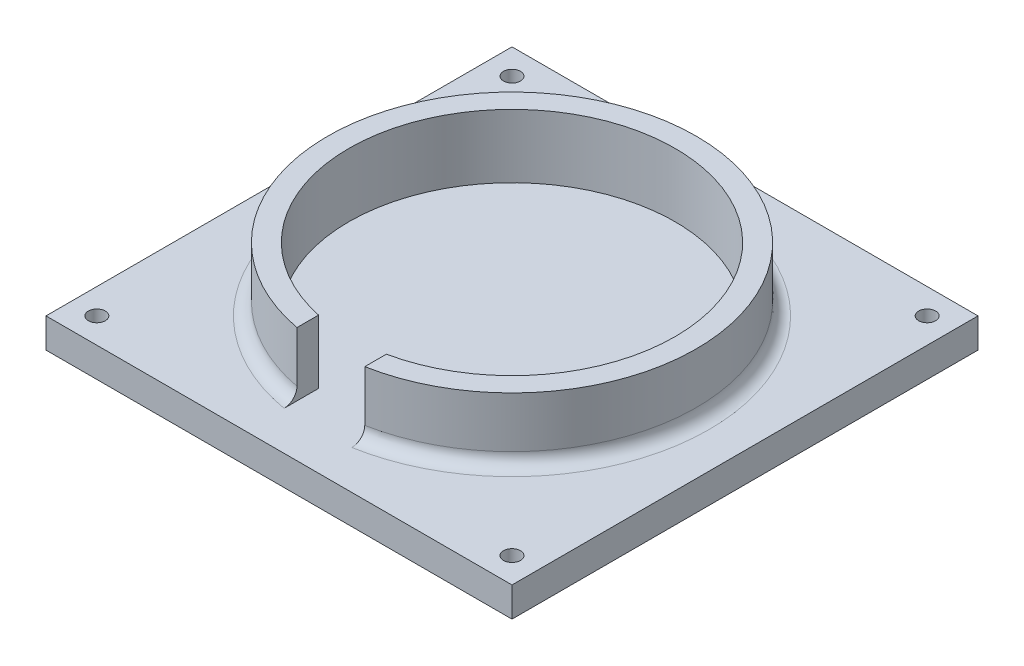
ISO-10303-21;
HEADER;
FILE_DESCRIPTION(('STEP AP214'),'2;1');
FILE_NAME('part.step','',(''),(''),'','','');
FILE_SCHEMA(('AUTOMOTIVE_DESIGN { 1 0 10303 214 1 1 1 1 }'));
ENDSEC;
DATA;
#1=APPLICATION_CONTEXT('core data for automotive mechanical design processes');
#2=APPLICATION_PROTOCOL_DEFINITION('international standard','automotive_design',2000,#1);
#3=PRODUCT_CONTEXT('',#1,'mechanical');
#4=PRODUCT('Part','Part','',(#3));
#5=PRODUCT_RELATED_PRODUCT_CATEGORY('part','',(#4));
#6=PRODUCT_DEFINITION_FORMATION('','',#4);
#7=PRODUCT_DEFINITION_CONTEXT('part definition',#1,'design');
#8=PRODUCT_DEFINITION('design','',#6,#7);
#9=PRODUCT_DEFINITION_SHAPE('','',#8);
#10=(LENGTH_UNIT() NAMED_UNIT(*) SI_UNIT(.MILLI.,.METRE.));
#11=(NAMED_UNIT(*) PLANE_ANGLE_UNIT() SI_UNIT($,.RADIAN.));
#12=(NAMED_UNIT(*) SI_UNIT($,.STERADIAN.) SOLID_ANGLE_UNIT());
#13=UNCERTAINTY_MEASURE_WITH_UNIT(LENGTH_MEASURE(1.E-05),#10,'distance_accuracy_value','');
#14=(GEOMETRIC_REPRESENTATION_CONTEXT(3) GLOBAL_UNCERTAINTY_ASSIGNED_CONTEXT((#13)) GLOBAL_UNIT_ASSIGNED_CONTEXT((#10,
#11,#12)) REPRESENTATION_CONTEXT('',''));
#15=CARTESIAN_POINT('',(0.,0.,0.));
#16=DIRECTION('',(0.,0.,1.));
#17=DIRECTION('',(1.,0.,0.));
#18=AXIS2_PLACEMENT_3D('',#15,#16,#17);
#19=CARTESIAN_POINT('',(83.4783234697371,7.,-31.7251665519029));
#20=DIRECTION('',(0.,0.,1.));
#21=DIRECTION('',(1.,0.,0.));
#22=AXIS2_PLACEMENT_3D('',#19,#20,#21);
#23=PLANE('',#22);
#24=DIRECTION('',(-1.,0.,0.));
#25=VECTOR('',#24,1.);
#26=CARTESIAN_POINT('',(83.4783234697371,0.,-31.7251665519029));
#27=LINE('',#26,#25);
#28=CARTESIAN_POINT('',(83.4783234697371,0.,-31.7251665519029));
#29=VERTEX_POINT('',#28);
#30=CARTESIAN_POINT('',(-26.5216765302629,0.,-31.7251665519029));
#31=VERTEX_POINT('',#30);
#32=EDGE_CURVE('E144',#29,#31,#27,.T.);
#33=ORIENTED_EDGE('',*,*,#32,.T.);
#34=DIRECTION('',(0.,-1.,0.));
#35=VECTOR('',#34,1.);
#36=CARTESIAN_POINT('',(-26.5216765302629,7.,-31.7251665519029));
#37=LINE('',#36,#35);
#38=CARTESIAN_POINT('',(-26.5216765302629,7.,-31.7251665519029));
#39=VERTEX_POINT('',#38);
#40=EDGE_CURVE('E186',#39,#31,#37,.T.);
#41=ORIENTED_EDGE('',*,*,#40,.F.);
#42=DIRECTION('',(-1.,0.,0.));
#43=VECTOR('',#42,1.);
#44=CARTESIAN_POINT('',(83.4783234697371,7.,-31.7251665519029));
#45=LINE('',#44,#43);
#46=CARTESIAN_POINT('',(83.4783234697371,7.,-31.7251665519029));
#47=VERTEX_POINT('',#46);
#48=EDGE_CURVE('E149',#47,#39,#45,.T.);
#49=ORIENTED_EDGE('',*,*,#48,.F.);
#50=DIRECTION('',(0.,-1.,0.));
#51=VECTOR('',#50,1.);
#52=CARTESIAN_POINT('',(83.4783234697371,7.,-31.7251665519029));
#53=LINE('',#52,#51);
#54=EDGE_CURVE('E163',#47,#29,#53,.T.);
#55=ORIENTED_EDGE('',*,*,#54,.T.);
#56=EDGE_LOOP('',(#33,#41,#49,#55));
#57=FACE_BOUND('',#56,.T.);
#58=ADVANCED_FACE('F38',(#57),#23,.F.);
#59=CARTESIAN_POINT('',(-26.5216765302629,7.,-31.7251665519029));
#60=DIRECTION('',(1.,0.,0.));
#61=DIRECTION('',(0.,0.,-1.));
#62=AXIS2_PLACEMENT_3D('',#59,#60,#61);
#63=PLANE('',#62);
#64=DIRECTION('',(0.,0.,1.));
#65=VECTOR('',#64,1.);
#66=CARTESIAN_POINT('',(-26.5216765302629,0.,-31.7251665519029));
#67=LINE('',#66,#65);
#68=CARTESIAN_POINT('',(-26.5216765302629,0.,78.2748334480971));
#69=VERTEX_POINT('',#68);
#70=EDGE_CURVE('E167',#31,#69,#67,.T.);
#71=ORIENTED_EDGE('',*,*,#70,.T.);
#72=DIRECTION('',(0.,-1.,0.));
#73=VECTOR('',#72,1.);
#74=CARTESIAN_POINT('',(-26.5216765302629,7.,78.2748334480971));
#75=LINE('',#74,#73);
#76=CARTESIAN_POINT('',(-26.5216765302629,7.,78.2748334480971));
#77=VERTEX_POINT('',#76);
#78=EDGE_CURVE('E182',#77,#69,#75,.T.);
#79=ORIENTED_EDGE('',*,*,#78,.F.);
#80=DIRECTION('',(0.,0.,1.));
#81=VECTOR('',#80,1.);
#82=CARTESIAN_POINT('',(-26.5216765302629,7.,-31.7251665519029));
#83=LINE('',#82,#81);
#84=EDGE_CURVE('E153',#39,#77,#83,.T.);
#85=ORIENTED_EDGE('',*,*,#84,.F.);
#86=ORIENTED_EDGE('',*,*,#40,.T.);
#87=EDGE_LOOP('',(#71,#79,#85,#86));
#88=FACE_BOUND('',#87,.T.);
#89=ADVANCED_FACE('F234',(#88),#63,.F.);
#90=CARTESIAN_POINT('',(-26.5216765302629,7.,78.2748334480971));
#91=DIRECTION('',(0.,0.,-1.));
#92=DIRECTION('',(-1.,0.,0.));
#93=AXIS2_PLACEMENT_3D('',#90,#91,#92);
#94=PLANE('',#93);
#95=DIRECTION('',(1.,0.,0.));
#96=VECTOR('',#95,1.);
#97=CARTESIAN_POINT('',(-26.5216765302629,0.,78.2748334480971));
#98=LINE('',#97,#96);
#99=CARTESIAN_POINT('',(83.4783234697371,0.,78.2748334480971));
#100=VERTEX_POINT('',#99);
#101=EDGE_CURVE('E170',#69,#100,#98,.T.);
#102=ORIENTED_EDGE('',*,*,#101,.T.);
#103=DIRECTION('',(0.,-1.,0.));
#104=VECTOR('',#103,1.);
#105=CARTESIAN_POINT('',(83.4783234697371,7.,78.2748334480971));
#106=LINE('',#105,#104);
#107=CARTESIAN_POINT('',(83.4783234697371,7.,78.2748334480971));
#108=VERTEX_POINT('',#107);
#109=EDGE_CURVE('E178',#108,#100,#106,.T.);
#110=ORIENTED_EDGE('',*,*,#109,.F.);
#111=DIRECTION('',(1.,0.,0.));
#112=VECTOR('',#111,1.);
#113=CARTESIAN_POINT('',(-26.5216765302629,7.,78.2748334480971));
#114=LINE('',#113,#112);
#115=EDGE_CURVE('E157',#77,#108,#114,.T.);
#116=ORIENTED_EDGE('',*,*,#115,.F.);
#117=ORIENTED_EDGE('',*,*,#78,.T.);
#118=EDGE_LOOP('',(#102,#110,#116,#117));
#119=FACE_BOUND('',#118,.T.);
#120=ADVANCED_FACE('F230',(#119),#94,.F.);
#121=CARTESIAN_POINT('',(83.4783234697371,7.,78.2748334480971));
#122=DIRECTION('',(-1.,0.,0.));
#123=DIRECTION('',(0.,0.,1.));
#124=AXIS2_PLACEMENT_3D('',#121,#122,#123);
#125=PLANE('',#124);
#126=DIRECTION('',(0.,0.,-1.));
#127=VECTOR('',#126,1.);
#128=CARTESIAN_POINT('',(83.4783234697371,0.,78.2748334480971));
#129=LINE('',#128,#127);
#130=EDGE_CURVE('E154',#100,#29,#129,.T.);
#131=ORIENTED_EDGE('',*,*,#130,.T.);
#132=ORIENTED_EDGE('',*,*,#54,.F.);
#133=DIRECTION('',(0.,0.,-1.));
#134=VECTOR('',#133,1.);
#135=CARTESIAN_POINT('',(83.4783234697371,7.,78.2748334480971));
#136=LINE('',#135,#134);
#137=EDGE_CURVE('E160',#108,#47,#136,.T.);
#138=ORIENTED_EDGE('',*,*,#137,.F.);
#139=ORIENTED_EDGE('',*,*,#109,.T.);
#140=EDGE_LOOP('',(#131,#132,#138,#139));
#141=FACE_BOUND('',#140,.T.);
#142=ADVANCED_FACE('F223',(#141),#125,.F.);
#143=CARTESIAN_POINT('',(0.,7.,0.));
#144=DIRECTION('',(0.,1.,0.));
#145=DIRECTION('',(0.,0.,1.));
#146=AXIS2_PLACEMENT_3D('',#143,#144,#145);
#147=PLANE('',#146);
#148=CARTESIAN_POINT('',(77.4783234697371,7.,72.2748334480971));
#149=DIRECTION('',(0.,1.,0.));
#150=DIRECTION('',(0.,0.,1.));
#151=AXIS2_PLACEMENT_3D('',#148,#149,#150);
#152=CIRCLE('',#151,2.);
#153=CARTESIAN_POINT('',(77.4783234697371,7.,74.2748334480971));
#154=VERTEX_POINT('',#153);
#155=EDGE_CURVE('E393',#154,#154,#152,.T.);
#156=ORIENTED_EDGE('',*,*,#155,.F.);
#157=EDGE_LOOP('',(#156));
#158=FACE_BOUND('',#157,.T.);
#159=CARTESIAN_POINT('',(77.4783234697371,7.,-25.7251665519029));
#160=DIRECTION('',(0.,1.,0.));
#161=DIRECTION('',(0.,0.,1.));
#162=AXIS2_PLACEMENT_3D('',#159,#160,#161);
#163=CIRCLE('',#162,2.);
#164=CARTESIAN_POINT('',(77.4783234697371,7.,-23.7251665519029));
#165=VERTEX_POINT('',#164);
#166=EDGE_CURVE('E401',#165,#165,#163,.T.);
#167=ORIENTED_EDGE('',*,*,#166,.F.);
#168=EDGE_LOOP('',(#167));
#169=FACE_BOUND('',#168,.T.);
#170=CARTESIAN_POINT('',(-20.5216765302629,7.,-25.7251665519029));
#171=DIRECTION('',(0.,1.,0.));
#172=DIRECTION('',(0.,0.,1.));
#173=AXIS2_PLACEMENT_3D('',#170,#171,#172);
#174=CIRCLE('',#173,2.);
#175=CARTESIAN_POINT('',(-20.5216765302629,7.,-23.7251665519029));
#176=VERTEX_POINT('',#175);
#177=EDGE_CURVE('E409',#176,#176,#174,.T.);
#178=ORIENTED_EDGE('',*,*,#177,.F.);
#179=EDGE_LOOP('',(#178));
#180=FACE_BOUND('',#179,.T.);
#181=CARTESIAN_POINT('',(-20.5216765302629,7.,72.2748334480971));
#182=DIRECTION('',(0.,1.,0.));
#183=DIRECTION('',(0.,0.,1.));
#184=AXIS2_PLACEMENT_3D('',#181,#182,#183);
#185=CIRCLE('',#184,2.);
#186=CARTESIAN_POINT('',(-20.5216765302629,7.,74.2748334480971));
#187=VERTEX_POINT('',#186);
#188=EDGE_CURVE('E385',#187,#187,#185,.T.);
#189=ORIENTED_EDGE('',*,*,#188,.F.);
#190=EDGE_LOOP('',(#189));
#191=FACE_BOUND('',#190,.T.);
#192=ORIENTED_EDGE('',*,*,#115,.T.);
#193=ORIENTED_EDGE('',*,*,#137,.T.);
#194=ORIENTED_EDGE('',*,*,#48,.T.);
#195=ORIENTED_EDGE('',*,*,#84,.T.);
#196=EDGE_LOOP('',(#192,#193,#194,#195));
#197=FACE_BOUND('',#196,.T.);
#198=DIRECTION('',(0.,0.,1.));
#199=VECTOR('',#198,1.);
#200=CARTESIAN_POINT('',(20.4783234697371,7.,56.2748334480971));
#201=LINE('',#200,#199);
#202=CARTESIAN_POINT('',(20.4783234697371,7.,60.9344935633982));
#203=VERTEX_POINT('',#202);
#204=CARTESIAN_POINT('',(20.4783234697371,7.,69.0814923526712));
#205=VERTEX_POINT('',#204);
#206=EDGE_CURVE('E60',#203,#205,#201,.T.);
#207=ORIENTED_EDGE('',*,*,#206,.T.);
#208=CARTESIAN_POINT('',(28.4783234697371,7.,23.2748334480971));
#209=DIRECTION('',(0.,1.,0.));
#210=DIRECTION('',(0.,0.,1.));
#211=AXIS2_PLACEMENT_3D('',#208,#209,#210);
#212=CIRCLE('',#211,46.5);
#213=CARTESIAN_POINT('',(36.4783234697371,7.,69.0814923526712));
#214=VERTEX_POINT('',#213);
#215=EDGE_CURVE('E196',#205,#214,#212,.F.);
#216=ORIENTED_EDGE('',*,*,#215,.T.);
#217=DIRECTION('',(0.,0.,1.));
#218=VECTOR('',#217,1.);
#219=CARTESIAN_POINT('',(36.4783234697371,7.,56.2748334480971));
#220=LINE('',#219,#218);
#221=CARTESIAN_POINT('',(36.4783234697371,7.,60.9344935633982));
#222=VERTEX_POINT('',#221);
#223=EDGE_CURVE('E67',#222,#214,#220,.T.);
#224=ORIENTED_EDGE('',*,*,#223,.F.);
#225=CARTESIAN_POINT('',(28.4783234697371,7.,23.2748334480971));
#226=DIRECTION('',(0.,1.,0.));
#227=DIRECTION('',(0.,0.,1.));
#228=AXIS2_PLACEMENT_3D('',#225,#226,#227);
#229=CIRCLE('',#228,38.5);
#230=EDGE_CURVE('E131',#203,#222,#229,.F.);
#231=ORIENTED_EDGE('',*,*,#230,.F.);
#232=EDGE_LOOP('',(#207,#216,#224,#231));
#233=FACE_BOUND('',#232,.T.);
#234=ADVANCED_FACE('F220',(#158,#169,#180,#191,#197,#233),#147,.T.);
#235=CARTESIAN_POINT('',(0.,0.,0.));
#236=DIRECTION('',(0.,1.,0.));
#237=DIRECTION('',(0.,0.,1.));
#238=AXIS2_PLACEMENT_3D('',#235,#236,#237);
#239=PLANE('',#238);
#240=CARTESIAN_POINT('',(77.4783234697371,0.,72.2748334480971));
#241=DIRECTION('',(0.,1.,0.));
#242=DIRECTION('',(0.,0.,1.));
#243=AXIS2_PLACEMENT_3D('',#240,#241,#242);
#244=CIRCLE('',#243,2.);
#245=CARTESIAN_POINT('',(77.4783234697371,0.,74.2748334480971));
#246=VERTEX_POINT('',#245);
#247=EDGE_CURVE('E397',#246,#246,#244,.T.);
#248=ORIENTED_EDGE('',*,*,#247,.T.);
#249=EDGE_LOOP('',(#248));
#250=FACE_BOUND('',#249,.T.);
#251=CARTESIAN_POINT('',(77.4783234697371,0.,-25.7251665519029));
#252=DIRECTION('',(0.,1.,0.));
#253=DIRECTION('',(0.,0.,1.));
#254=AXIS2_PLACEMENT_3D('',#251,#252,#253);
#255=CIRCLE('',#254,2.);
#256=CARTESIAN_POINT('',(77.4783234697371,0.,-23.7251665519029));
#257=VERTEX_POINT('',#256);
#258=EDGE_CURVE('E405',#257,#257,#255,.T.);
#259=ORIENTED_EDGE('',*,*,#258,.T.);
#260=EDGE_LOOP('',(#259));
#261=FACE_BOUND('',#260,.T.);
#262=CARTESIAN_POINT('',(-20.5216765302629,0.,-25.7251665519029));
#263=DIRECTION('',(0.,1.,0.));
#264=DIRECTION('',(0.,0.,1.));
#265=AXIS2_PLACEMENT_3D('',#262,#263,#264);
#266=CIRCLE('',#265,2.);
#267=CARTESIAN_POINT('',(-20.5216765302629,0.,-23.7251665519029));
#268=VERTEX_POINT('',#267);
#269=EDGE_CURVE('E389',#268,#268,#266,.T.);
#270=ORIENTED_EDGE('',*,*,#269,.T.);
#271=EDGE_LOOP('',(#270));
#272=FACE_BOUND('',#271,.T.);
#273=CARTESIAN_POINT('',(-20.5216765302629,0.,72.2748334480971));
#274=DIRECTION('',(0.,1.,0.));
#275=DIRECTION('',(0.,0.,1.));
#276=AXIS2_PLACEMENT_3D('',#273,#274,#275);
#277=CIRCLE('',#276,2.);
#278=CARTESIAN_POINT('',(-20.5216765302629,0.,74.2748334480971));
#279=VERTEX_POINT('',#278);
#280=EDGE_CURVE('E382',#279,#279,#277,.T.);
#281=ORIENTED_EDGE('',*,*,#280,.T.);
#282=EDGE_LOOP('',(#281));
#283=FACE_BOUND('',#282,.T.);
#284=ORIENTED_EDGE('',*,*,#32,.F.);
#285=ORIENTED_EDGE('',*,*,#130,.F.);
#286=ORIENTED_EDGE('',*,*,#101,.F.);
#287=ORIENTED_EDGE('',*,*,#70,.F.);
#288=EDGE_LOOP('',(#284,#285,#286,#287));
#289=FACE_BOUND('',#288,.T.);
#290=ADVANCED_FACE('F216',(#250,#261,#272,#283,#289),#239,.F.);
#291=CARTESIAN_POINT('',(28.4783234697371,22.,23.2748334480971));
#292=DIRECTION('',(0.,1.,0.));
#293=DIRECTION('',(0.,0.,1.));
#294=AXIS2_PLACEMENT_3D('',#291,#292,#293);
#295=PLANE('',#294);
#296=DIRECTION('',(0.,0.,1.));
#297=VECTOR('',#296,1.);
#298=CARTESIAN_POINT('',(20.4783234697371,22.,23.2748334480971));
#299=LINE('',#298,#297);
#300=CARTESIAN_POINT('',(20.4783234697371,22.,60.9344935633982));
#301=VERTEX_POINT('',#300);
#302=CARTESIAN_POINT('',(20.4783234697371,22.,66.0328736276937));
#303=VERTEX_POINT('',#302);
#304=EDGE_CURVE('E137',#301,#303,#299,.T.);
#305=ORIENTED_EDGE('',*,*,#304,.F.);
#306=CARTESIAN_POINT('',(28.4783234697371,22.,23.2748334480971));
#307=DIRECTION('',(0.,1.,0.));
#308=DIRECTION('',(0.,0.,1.));
#309=AXIS2_PLACEMENT_3D('',#306,#307,#308);
#310=CIRCLE('',#309,38.5);
#311=CARTESIAN_POINT('',(36.4783234697371,22.,60.9344935633982));
#312=VERTEX_POINT('',#311);
#313=EDGE_CURVE('E130',#312,#301,#310,.T.);
#314=ORIENTED_EDGE('',*,*,#313,.F.);
#315=DIRECTION('',(0.,0.,-1.));
#316=VECTOR('',#315,1.);
#317=CARTESIAN_POINT('',(36.4783234697371,22.,23.2748334480971));
#318=LINE('',#317,#316);
#319=CARTESIAN_POINT('',(36.4783234697371,22.,66.0328736276937));
#320=VERTEX_POINT('',#319);
#321=EDGE_CURVE('E113',#320,#312,#318,.T.);
#322=ORIENTED_EDGE('',*,*,#321,.F.);
#323=CARTESIAN_POINT('',(28.4783234697371,22.,23.2748334480971));
#324=DIRECTION('',(0.,1.,0.));
#325=DIRECTION('',(0.,0.,1.));
#326=AXIS2_PLACEMENT_3D('',#323,#324,#325);
#327=CIRCLE('',#326,43.5);
#328=EDGE_CURVE('E139',#320,#303,#327,.T.);
#329=ORIENTED_EDGE('',*,*,#328,.T.);
#330=EDGE_LOOP('',(#305,#314,#322,#329));
#331=FACE_BOUND('',#330,.T.);
#332=ADVANCED_FACE('F135',(#331),#295,.T.);
#333=CARTESIAN_POINT('',(28.4783234697371,22.,23.2748334480971));
#334=DIRECTION('',(0.,-1.,0.));
#335=DIRECTION('',(0.,0.,-1.));
#336=AXIS2_PLACEMENT_3D('',#333,#334,#335);
#337=CYLINDRICAL_SURFACE('',#336,43.5);
#338=DIRECTION('',(0.,-1.,0.));
#339=VECTOR('',#338,1.);
#340=CARTESIAN_POINT('',(36.4783234697371,22.,66.0328736276937));
#341=LINE('',#340,#339);
#342=CARTESIAN_POINT('',(36.4783234697371,10.,66.0328736276937));
#343=VERTEX_POINT('',#342);
#344=EDGE_CURVE('E119',#320,#343,#341,.T.);
#345=ORIENTED_EDGE('',*,*,#344,.T.);
#346=CARTESIAN_POINT('',(28.4783234697371,10.,23.2748334480971));
#347=DIRECTION('',(0.,1.,0.));
#348=DIRECTION('',(0.,0.,1.));
#349=AXIS2_PLACEMENT_3D('',#346,#347,#348);
#350=CIRCLE('',#349,43.5);
#351=CARTESIAN_POINT('',(20.4783234697371,10.,66.0328736276937));
#352=VERTEX_POINT('',#351);
#353=EDGE_CURVE('E192',#343,#352,#350,.T.);
#354=ORIENTED_EDGE('',*,*,#353,.T.);
#355=DIRECTION('',(0.,-1.,0.));
#356=VECTOR('',#355,1.);
#357=CARTESIAN_POINT('',(20.4783234697371,22.,66.0328736276937));
#358=LINE('',#357,#356);
#359=EDGE_CURVE('E140',#352,#303,#358,.F.);
#360=ORIENTED_EDGE('',*,*,#359,.T.);
#361=ORIENTED_EDGE('',*,*,#328,.F.);
#362=EDGE_LOOP('',(#345,#354,#360,#361));
#363=FACE_BOUND('',#362,.T.);
#364=ADVANCED_FACE('F213',(#363),#337,.T.);
#365=CARTESIAN_POINT('',(28.4783234697371,22.,23.2748334480971));
#366=DIRECTION('',(0.,-1.,0.));
#367=DIRECTION('',(0.,0.,-1.));
#368=AXIS2_PLACEMENT_3D('',#365,#366,#367);
#369=CYLINDRICAL_SURFACE('',#368,38.5);
#370=DIRECTION('',(0.,-1.,0.));
#371=VECTOR('',#370,1.);
#372=CARTESIAN_POINT('',(20.4783234697371,22.,60.9344935633982));
#373=LINE('',#372,#371);
#374=EDGE_CURVE('E374',#203,#301,#373,.F.);
#375=ORIENTED_EDGE('',*,*,#374,.F.);
#376=ORIENTED_EDGE('',*,*,#230,.T.);
#377=DIRECTION('',(0.,-1.,0.));
#378=VECTOR('',#377,1.);
#379=CARTESIAN_POINT('',(36.4783234697371,22.,60.9344935633982));
#380=LINE('',#379,#378);
#381=EDGE_CURVE('E116',#312,#222,#380,.T.);
#382=ORIENTED_EDGE('',*,*,#381,.F.);
#383=ORIENTED_EDGE('',*,*,#313,.T.);
#384=EDGE_LOOP('',(#375,#376,#382,#383));
#385=FACE_BOUND('',#384,.T.);
#386=ADVANCED_FACE('F129',(#385),#369,.F.);
#387=CARTESIAN_POINT('',(20.4783234697371,27.,56.2748334480971));
#388=DIRECTION('',(-1.,0.,0.));
#389=DIRECTION('',(0.,0.,1.));
#390=AXIS2_PLACEMENT_3D('',#387,#388,#389);
#391=PLANE('',#390);
#392=ORIENTED_EDGE('',*,*,#206,.F.);
#393=ORIENTED_EDGE('',*,*,#374,.T.);
#394=ORIENTED_EDGE('',*,*,#304,.T.);
#395=ORIENTED_EDGE('',*,*,#359,.F.);
#396=CARTESIAN_POINT('',(20.4783234697371,10.,66.0328736276937));
#397=CARTESIAN_POINT('',(20.4783234697371,9.91664310957152,66.0328645665763));
#398=CARTESIAN_POINT('',(20.4783234697371,9.83329053672385,66.0364080194102));
#399=CARTESIAN_POINT('',(20.4783234697371,9.66719030352948,66.0505300283163));
#400=CARTESIAN_POINT('',(20.4783234697371,9.58444259280471,66.0611079915865));
#401=CARTESIAN_POINT('',(20.4783234697371,9.42023679836731,66.0892115445538));
#402=CARTESIAN_POINT('',(20.4783234697371,9.33877723204273,66.1067284340176));
#403=CARTESIAN_POINT('',(20.4783234697371,9.17764483845864,66.1485542336615));
#404=CARTESIAN_POINT('',(20.4783234697371,9.09797200196303,66.1728631087233));
#405=CARTESIAN_POINT('',(20.4783234697371,8.86242698587997,66.2557456016294));
#406=CARTESIAN_POINT('',(20.4783234697371,8.70993116451744,66.3242918405667));
#407=CARTESIAN_POINT('',(20.4783234697371,8.41858650733331,66.4857818113088));
#408=CARTESIAN_POINT('',(20.4783234697371,8.27973723629234,66.5787247646998));
#409=CARTESIAN_POINT('',(20.4783234697371,8.01827917727173,66.7870813132361));
#410=CARTESIAN_POINT('',(20.4783234697371,7.895804355195,66.9026632018993));
#411=CARTESIAN_POINT('',(20.4783234697371,7.67161063703645,67.1524797543922));
#412=CARTESIAN_POINT('',(20.4783234697371,7.56989648979917,67.2867186740965));
#413=CARTESIAN_POINT('',(20.4783234697371,7.3883997073077,67.5723220160877));
#414=CARTESIAN_POINT('',(20.4783234697371,7.30899643784985,67.7239273136903));
#415=CARTESIAN_POINT('',(20.4783234697371,7.17640450650136,68.03816926582));
#416=CARTESIAN_POINT('',(20.4783234697371,7.12320584735583,68.2008016864358));
#417=CARTESIAN_POINT('',(20.4783234697371,7.05594973746514,68.4836972752554));
#418=CARTESIAN_POINT('',(20.4783234697371,7.03498415814939,68.6023672006369));
#419=CARTESIAN_POINT('',(20.4783234697371,7.00700952995192,68.8411741876584));
#420=CARTESIAN_POINT('',(20.4783234697371,6.99998124242107,68.9613089962582));
#421=CARTESIAN_POINT('',(20.4783234697371,7.,69.0814923526712));
#422=B_SPLINE_CURVE_WITH_KNOTS('',3,(#396,#397,#398,#399,#400,#401,#402,#403,#404,#405,#406,
#407,#408,#409,#410,#411,#412,#413,#414,#415,#416,#417,#418,#419,#420,#421),.UNSPECIFIED.,.F.,
.F.,(4,2,2,2,2,2,2,2,2,2,2,2,4),(0.,0.249987728327523,0.499954392719122,0.749608628445541,
0.999261573342437,1.49827548042416,1.99727346765551,2.500132245888,3.00310592060424,
3.51417553849945,4.02505002820825,4.38579932303879,4.74605030200117),.UNSPECIFIED.);
#423=EDGE_CURVE('E53',#352,#205,#422,.T.);
#424=ORIENTED_EDGE('',*,*,#423,.T.);
#425=EDGE_LOOP('',(#392,#393,#394,#395,#424));
#426=FACE_BOUND('',#425,.T.);
#427=ADVANCED_FACE('F204',(#426),#391,.F.);
#428=CARTESIAN_POINT('',(36.4783234697371,7.,56.2748334480971));
#429=DIRECTION('',(1.,0.,0.));
#430=DIRECTION('',(0.,0.,-1.));
#431=AXIS2_PLACEMENT_3D('',#428,#429,#430);
#432=PLANE('',#431);
#433=ORIENTED_EDGE('',*,*,#321,.T.);
#434=ORIENTED_EDGE('',*,*,#381,.T.);
#435=ORIENTED_EDGE('',*,*,#223,.T.);
#436=CARTESIAN_POINT('',(36.4783234697371,7.,69.0814923526712));
#437=CARTESIAN_POINT('',(36.4783234697371,6.99999262063546,68.9947663270463));
#438=CARTESIAN_POINT('',(36.4783234697371,7.00364939968284,68.9080441263933));
#439=CARTESIAN_POINT('',(36.4783234697371,7.01823010701756,68.735214984136));
#440=CARTESIAN_POINT('',(36.4783234697371,7.02915384285899,68.6491080262996));
#441=CARTESIAN_POINT('',(36.4783234697371,7.05820216262658,68.4781425710868));
#442=CARTESIAN_POINT('',(36.4783234697371,7.076324197482,68.3932836427762));
#443=CARTESIAN_POINT('',(36.4783234697371,7.1196309091783,68.2254133572318));
#444=CARTESIAN_POINT('',(36.4783234697371,7.14481547732546,68.1424019715852));
#445=CARTESIAN_POINT('',(36.4783234697371,7.23078419589064,67.8969248676378));
#446=CARTESIAN_POINT('',(36.4783234697371,7.30199198990774,67.7379656004913));
#447=CARTESIAN_POINT('',(36.4783234697371,7.47019079707268,67.43448483464));
#448=CARTESIAN_POINT('',(36.4783234697371,7.56717461509782,67.2899593223599));
#449=CARTESIAN_POINT('',(36.4783234697371,7.78366451970528,67.0203204544729));
#450=CARTESIAN_POINT('',(36.4783234697371,7.90302826914966,66.895093063672));
#451=CARTESIAN_POINT('',(36.4783234697371,8.16140177797134,66.6668064276448));
#452=CARTESIAN_POINT('',(36.4783234697371,8.30041459241617,66.56375063599));
#453=CARTESIAN_POINT('',(36.4783234697371,8.59189600560433,66.3844255718145));
#454=CARTESIAN_POINT('',(36.4783234697371,8.7441340416848,66.3077811257828));
#455=CARTESIAN_POINT('',(36.4783234697371,9.05941226077543,66.1816472862568));
#456=CARTESIAN_POINT('',(36.4783234697371,9.22244334680788,66.1321353425248));
#457=CARTESIAN_POINT('',(36.4783234697371,9.48893337043028,66.0756663726761));
#458=CARTESIAN_POINT('',(36.4783234697371,9.59055438822012,66.0596286910522));
#459=CARTESIAN_POINT('',(36.4783234697371,9.79476767323816,66.0382349552388));
#460=CARTESIAN_POINT('',(36.4783234697371,9.89735834851521,66.0328636990838));
#461=CARTESIAN_POINT('',(36.4783234697371,10.,66.0328736276937));
#462=B_SPLINE_CURVE_WITH_KNOTS('',3,(#436,#437,#438,#439,#440,#441,#442,#443,#444,#445,#446,
#447,#448,#449,#450,#451,#452,#453,#454,#455,#456,#457,#458,#459,#460,#461),.UNSPECIFIED.,.F.,
.F.,(4,2,2,2,2,2,2,2,2,2,2,2,4),(0.,0.260094114624295,0.520181341625868,0.780176548203898,
1.04016775362624,1.55999810656709,2.07968350612049,2.59616939977279,3.11273568597906,
3.62162835395324,4.13009742950096,4.4382219210497,4.74590695241864),.UNSPECIFIED.);
#463=EDGE_CURVE('E11',#214,#343,#462,.T.);
#464=ORIENTED_EDGE('',*,*,#463,.T.);
#465=ORIENTED_EDGE('',*,*,#344,.F.);
#466=EDGE_LOOP('',(#433,#434,#435,#464,#465));
#467=FACE_BOUND('',#466,.T.);
#468=ADVANCED_FACE('F115',(#467),#432,.F.);
#469=CARTESIAN_POINT('',(-20.5216765302629,0.,72.2748334480971));
#470=DIRECTION('',(0.,1.,0.));
#471=DIRECTION('',(0.,0.,1.));
#472=AXIS2_PLACEMENT_3D('',#469,#470,#471);
#473=CYLINDRICAL_SURFACE('',#472,2.);
#474=ORIENTED_EDGE('',*,*,#280,.F.);
#475=EDGE_LOOP('',(#474));
#476=FACE_BOUND('',#475,.T.);
#477=ORIENTED_EDGE('',*,*,#188,.T.);
#478=EDGE_LOOP('',(#477));
#479=FACE_BOUND('',#478,.T.);
#480=ADVANCED_FACE('F298',(#476,#479),#473,.F.);
#481=CARTESIAN_POINT('',(-20.5216765302629,0.,-25.7251665519029));
#482=DIRECTION('',(0.,1.,0.));
#483=DIRECTION('',(0.,0.,1.));
#484=AXIS2_PLACEMENT_3D('',#481,#482,#483);
#485=CYLINDRICAL_SURFACE('',#484,2.);
#486=ORIENTED_EDGE('',*,*,#269,.F.);
#487=EDGE_LOOP('',(#486));
#488=FACE_BOUND('',#487,.T.);
#489=ORIENTED_EDGE('',*,*,#177,.T.);
#490=EDGE_LOOP('',(#489));
#491=FACE_BOUND('',#490,.T.);
#492=ADVANCED_FACE('F304',(#488,#491),#485,.F.);
#493=CARTESIAN_POINT('',(77.4783234697371,0.,-25.7251665519029));
#494=DIRECTION('',(0.,1.,0.));
#495=DIRECTION('',(0.,0.,1.));
#496=AXIS2_PLACEMENT_3D('',#493,#494,#495);
#497=CYLINDRICAL_SURFACE('',#496,2.);
#498=ORIENTED_EDGE('',*,*,#258,.F.);
#499=EDGE_LOOP('',(#498));
#500=FACE_BOUND('',#499,.T.);
#501=ORIENTED_EDGE('',*,*,#166,.T.);
#502=EDGE_LOOP('',(#501));
#503=FACE_BOUND('',#502,.T.);
#504=ADVANCED_FACE('F311',(#500,#503),#497,.F.);
#505=CARTESIAN_POINT('',(77.4783234697371,0.,72.2748334480971));
#506=DIRECTION('',(0.,1.,0.));
#507=DIRECTION('',(0.,0.,1.));
#508=AXIS2_PLACEMENT_3D('',#505,#506,#507);
#509=CYLINDRICAL_SURFACE('',#508,2.);
#510=ORIENTED_EDGE('',*,*,#247,.F.);
#511=EDGE_LOOP('',(#510));
#512=FACE_BOUND('',#511,.T.);
#513=ORIENTED_EDGE('',*,*,#155,.T.);
#514=EDGE_LOOP('',(#513));
#515=FACE_BOUND('',#514,.T.);
#516=ADVANCED_FACE('F319',(#512,#515),#509,.F.);
#517=CARTESIAN_POINT('',(28.4783234697371,10.,23.2748334480971));
#518=DIRECTION('',(0.,1.,0.));
#519=DIRECTION('',(0.,0.,1.));
#520=AXIS2_PLACEMENT_3D('',#517,#518,#519);
#521=TOROIDAL_SURFACE('',#520,46.5,3.);
#522=ORIENTED_EDGE('',*,*,#463,.F.);
#523=ORIENTED_EDGE('',*,*,#215,.F.);
#524=ORIENTED_EDGE('',*,*,#423,.F.);
#525=ORIENTED_EDGE('',*,*,#353,.F.);
#526=EDGE_LOOP('',(#522,#523,#524,#525));
#527=FACE_BOUND('',#526,.T.);
#528=ADVANCED_FACE('F40',(#527),#521,.F.);
#529=CLOSED_SHELL('',(#58,#89,#120,#142,#234,#290,#332,#364,#386,#427,#468,#480,#492,#504,#516,#528));
#530=MANIFOLD_SOLID_BREP('B2',#529);
#531=ADVANCED_BREP_SHAPE_REPRESENTATION('',(#18,#530),#14);
#532=SHAPE_DEFINITION_REPRESENTATION(#9,#531);
ENDSEC;
END-ISO-10303-21;
